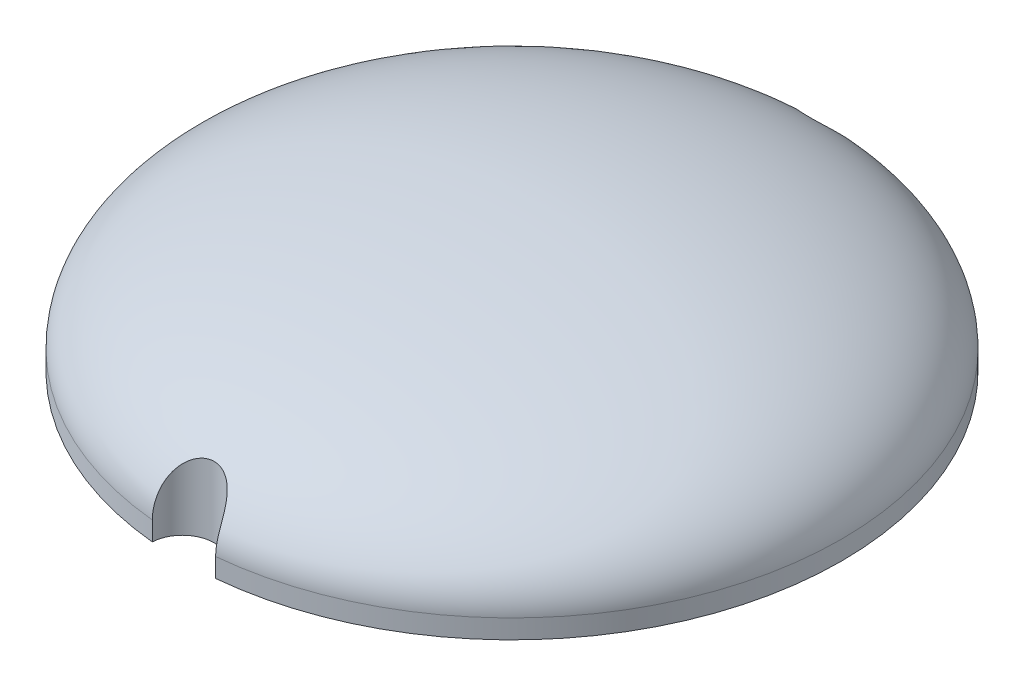
ISO-10303-21;
HEADER;
FILE_DESCRIPTION(('STEP AP214'),'2;1');
FILE_NAME('part.step','',(''),(''),'','','');
FILE_SCHEMA(('AUTOMOTIVE_DESIGN { 1 0 10303 214 1 1 1 1 }'));
ENDSEC;
DATA;
#1=APPLICATION_CONTEXT('core data for automotive mechanical design processes');
#2=APPLICATION_PROTOCOL_DEFINITION('international standard','automotive_design',2000,#1);
#3=PRODUCT_CONTEXT('',#1,'mechanical');
#4=PRODUCT('Part','Part','',(#3));
#5=PRODUCT_RELATED_PRODUCT_CATEGORY('part','',(#4));
#6=PRODUCT_DEFINITION_FORMATION('','',#4);
#7=PRODUCT_DEFINITION_CONTEXT('part definition',#1,'design');
#8=PRODUCT_DEFINITION('design','',#6,#7);
#9=PRODUCT_DEFINITION_SHAPE('','',#8);
#10=(LENGTH_UNIT() NAMED_UNIT(*) SI_UNIT(.MILLI.,.METRE.));
#11=(NAMED_UNIT(*) PLANE_ANGLE_UNIT() SI_UNIT($,.RADIAN.));
#12=(NAMED_UNIT(*) SI_UNIT($,.STERADIAN.) SOLID_ANGLE_UNIT());
#13=UNCERTAINTY_MEASURE_WITH_UNIT(LENGTH_MEASURE(1.E-05),#10,'distance_accuracy_value','');
#14=(GEOMETRIC_REPRESENTATION_CONTEXT(3) GLOBAL_UNCERTAINTY_ASSIGNED_CONTEXT((#13)) GLOBAL_UNIT_ASSIGNED_CONTEXT((#10,
#11,#12)) REPRESENTATION_CONTEXT('',''));
#15=CARTESIAN_POINT('',(0.,0.,0.));
#16=DIRECTION('',(0.,0.,1.));
#17=DIRECTION('',(1.,0.,0.));
#18=AXIS2_PLACEMENT_3D('',#15,#16,#17);
#19=CARTESIAN_POINT('',(0.,1.5,0.));
#20=DIRECTION('',(0.,-1.,0.));
#21=DIRECTION('',(0.,0.,-1.));
#22=AXIS2_PLACEMENT_3D('',#19,#20,#21);
#23=CYLINDRICAL_SURFACE('',#22,26.);
#24=DIRECTION('',(0.,-1.,0.));
#25=VECTOR('',#24,1.);
#26=CARTESIAN_POINT('',(2.49710909036262,5.5,-25.8798076923077));
#27=LINE('',#26,#25);
#28=CARTESIAN_POINT('',(2.49710909036262,1.50000000000001,-25.8798076923077));
#29=VERTEX_POINT('',#28);
#30=CARTESIAN_POINT('',(2.49710909036262,0.,-25.8798076923077));
#31=VERTEX_POINT('',#30);
#32=EDGE_CURVE('E215',#29,#31,#27,.T.);
#33=ORIENTED_EDGE('',*,*,#32,.F.);
#34=CARTESIAN_POINT('',(0.,1.5,0.));
#35=DIRECTION('',(0.,1.,0.));
#36=DIRECTION('',(0.,0.,1.));
#37=AXIS2_PLACEMENT_3D('',#34,#35,#36);
#38=CIRCLE('',#37,26.);
#39=CARTESIAN_POINT('',(2.49710909036262,1.5,25.8798076923077));
#40=VERTEX_POINT('',#39);
#41=EDGE_CURVE('E122',#40,#29,#38,.T.);
#42=ORIENTED_EDGE('',*,*,#41,.F.);
#43=DIRECTION('',(0.,-1.,0.));
#44=VECTOR('',#43,1.);
#45=CARTESIAN_POINT('',(2.49710909036262,5.5,25.8798076923077));
#46=LINE('',#45,#44);
#47=CARTESIAN_POINT('',(2.49710909036262,0.,25.8798076923077));
#48=VERTEX_POINT('',#47);
#49=EDGE_CURVE('E60',#48,#40,#46,.F.);
#50=ORIENTED_EDGE('',*,*,#49,.F.);
#51=CARTESIAN_POINT('',(0.,0.,0.));
#52=DIRECTION('',(0.,1.,0.));
#53=DIRECTION('',(0.,0.,1.));
#54=AXIS2_PLACEMENT_3D('',#51,#52,#53);
#55=CIRCLE('',#54,26.);
#56=EDGE_CURVE('E120',#48,#31,#55,.T.);
#57=ORIENTED_EDGE('',*,*,#56,.T.);
#58=EDGE_LOOP('',(#33,#42,#50,#57));
#59=FACE_BOUND('',#58,.T.);
#60=ADVANCED_FACE('F33',(#59),#23,.T.);
#61=DIRECTION('',(0.,-1.,0.));
#62=VECTOR('',#61,1.);
#63=CARTESIAN_POINT('',(-2.49710909036261,5.5,-25.8798076923077));
#64=LINE('',#63,#62);
#65=CARTESIAN_POINT('',(-2.49710909036261,0.,-25.8798076923077));
#66=VERTEX_POINT('',#65);
#67=CARTESIAN_POINT('',(-2.49710909036261,1.5,-25.8798076923077));
#68=VERTEX_POINT('',#67);
#69=EDGE_CURVE('E52',#66,#68,#64,.F.);
#70=ORIENTED_EDGE('',*,*,#69,.F.);
#71=CARTESIAN_POINT('',(-2.49710909036261,0.,25.8798076923077));
#72=VERTEX_POINT('',#71);
#73=EDGE_CURVE('E128',#66,#72,#55,.T.);
#74=ORIENTED_EDGE('',*,*,#73,.T.);
#75=DIRECTION('',(0.,-1.,0.));
#76=VECTOR('',#75,1.);
#77=CARTESIAN_POINT('',(-2.49710909036261,5.5,25.8798076923077));
#78=LINE('',#77,#76);
#79=CARTESIAN_POINT('',(-2.49710909036261,1.5,25.8798076923077));
#80=VERTEX_POINT('',#79);
#81=EDGE_CURVE('E109',#80,#72,#78,.T.);
#82=ORIENTED_EDGE('',*,*,#81,.F.);
#83=EDGE_CURVE('E127',#68,#80,#38,.T.);
#84=ORIENTED_EDGE('',*,*,#83,.F.);
#85=EDGE_LOOP('',(#70,#74,#82,#84));
#86=FACE_BOUND('',#85,.T.);
#87=ADVANCED_FACE('F222',(#86),#23,.T.);
#88=CARTESIAN_POINT('',(0.,1.5,2.53941832839555E-11));
#89=DIRECTION('',(-1.,0.,0.));
#90=DIRECTION('',(0.,0.,1.));
#91=AXIS2_PLACEMENT_3D('',#88,#89,#90);
#92=ELLIPSE('',#91,25.9999999999746,9.5);
#93=TRIMMED_CURVE('',#92,(PARAMETER_VALUE(-1.57079632679587)),
(PARAMETER_VALUE(1.57079632679587)),.T.,.PARAMETER.);
#94=CARTESIAN_POINT('',(0.,14.2648787199803,0.));
#95=DIRECTION('',(0.,1.,0.));
#96=AXIS1_PLACEMENT('',#94,#95);
#97=SURFACE_OF_REVOLUTION('',#93,#96);
#98=CARTESIAN_POINT('',(0.,11.,2.53894071614388E-11));
#99=VERTEX_POINT('',#98);
#100=VERTEX_LOOP('',#99);
#101=FACE_BOUND('',#100,.T.);
#102=CARTESIAN_POINT('',(-2.4971090903626,1.50000000000001,-25.8798076923077));
#103=CARTESIAN_POINT('',(-2.49710624394118,1.55341695904701,-25.8798097912219));
#104=CARTESIAN_POINT('',(-2.49705005869269,1.60682605746529,-25.8785742050383));
#105=CARTESIAN_POINT('',(-2.49680687563137,1.71352660882144,-25.8736498455342));
#106=CARTESIAN_POINT('',(-2.49661988822556,1.76681807078045,-25.8699612673824));
#107=CARTESIAN_POINT('',(-2.49582716819387,1.92624465997996,-25.855261117715));
#108=CARTESIAN_POINT('',(-2.49498978936412,2.03206426873638,-25.8406150197973));
#109=CARTESIAN_POINT('',(-2.4922372094038,2.2412986118201,-25.8022198375015));
#110=CARTESIAN_POINT('',(-2.49032890980472,2.34472437313747,-25.7785293490173));
#111=CARTESIAN_POINT('',(-2.48473508591958,2.549244613511,-25.7227340091191));
#112=CARTESIAN_POINT('',(-2.48104921357176,2.65033863193094,-25.6906275103509));
#113=CARTESIAN_POINT('',(-2.47121978776096,2.84606182265476,-25.6201456029459));
#114=CARTESIAN_POINT('',(-2.46516980842894,2.9407926143211,-25.5820384959844));
#115=CARTESIAN_POINT('',(-2.44977777276218,3.12722151203189,-25.499653127718));
#116=CARTESIAN_POINT('',(-2.44043584602792,3.21891973730982,-25.4553751093969));
#117=CARTESIAN_POINT('',(-2.40610433895195,3.48934192510849,-25.3144313995545));
#118=CARTESIAN_POINT('',(-2.37481453487873,3.66321939221226,-25.2097213909558));
#119=CARTESIAN_POINT('',(-2.29044688771419,3.98831960619873,-24.9915673466667));
#120=CARTESIAN_POINT('',(-2.2383898215817,4.1402029905835,-24.8787114432373));
#121=CARTESIAN_POINT('',(-2.10711805869213,4.42768197950864,-24.6481202505872));
#122=CARTESIAN_POINT('',(-2.02795001459273,4.56330502715286,-24.530393646847));
#123=CARTESIAN_POINT('',(-1.86175210276437,4.78393307138339,-24.3277017031838));
#124=CARTESIAN_POINT('',(-1.78147665533087,4.87317255760813,-24.2418173089197));
#125=CARTESIAN_POINT('',(-1.60227497817917,5.03859251381934,-24.0771196668494));
#126=CARTESIAN_POINT('',(-1.50336954981815,5.11478736941751,-23.9982986758591));
#127=CARTESIAN_POINT('',(-1.30541422339308,5.24028880751139,-23.8651324635633));
#128=CARTESIAN_POINT('',(-1.20914316565512,5.29196057356589,-23.8088978241283));
#129=CARTESIAN_POINT('',(-1.00523721648505,5.38305677182212,-23.7081879964541));
#130=CARTESIAN_POINT('',(-0.897606387911855,5.42248556300851,-23.6637086237151));
#131=CARTESIAN_POINT('',(-0.672713758007499,5.48780819015115,-23.58928231491));
#132=CARTESIAN_POINT('',(-0.555398293530508,5.51361981329053,-23.5594237269234));
#133=CARTESIAN_POINT('',(-0.315402397392194,5.55015473552205,-23.516989553604));
#134=CARTESIAN_POINT('',(-0.192724805916543,5.56088592483663,-23.5044049304532));
#135=CARTESIAN_POINT('',(0.0403802235505786,5.5664401472196,-23.4978999174672));
#136=CARTESIAN_POINT('',(0.150725068286989,5.5628315437781,-23.5021393815487));
#137=CARTESIAN_POINT('',(0.368791875807462,5.54331854653264,-23.524923644475));
#138=CARTESIAN_POINT('',(0.476514301768498,5.52741634054249,-23.5434658979427));
#139=CARTESIAN_POINT('',(0.684340286308243,5.48435310393289,-23.5931586839655));
#140=CARTESIAN_POINT('',(0.784550313513725,5.45741375476774,-23.6240606951149));
#141=CARTESIAN_POINT('',(0.977412599647034,5.39319743621409,-23.6966779640195));
#142=CARTESIAN_POINT('',(1.07006347985996,5.35591858643191,-23.7383951885938));
#143=CARTESIAN_POINT('',(1.25389422448846,5.26845471813444,-23.8344959234215));
#144=CARTESIAN_POINT('',(1.34426718074681,5.21743729668224,-23.8896586597765));
#145=CARTESIAN_POINT('',(1.51340834310876,5.1057706812144,-24.0074532562347));
#146=CARTESIAN_POINT('',(1.59216904597103,5.04511531177922,-24.0700898987164));
#147=CARTESIAN_POINT('',(1.77054402623766,4.88625451197404,-24.2293608895777));
#148=CARTESIAN_POINT('',(1.86367401808021,4.78340688736514,-24.3286462820304));
#149=CARTESIAN_POINT('',(2.02643267298602,4.56297454059813,-24.5301644309007));
#150=CARTESIAN_POINT('',(2.09601749731148,4.44536288119333,-24.6324023047398));
#151=CARTESIAN_POINT('',(2.19359068739828,4.24119529961586,-24.798370554309));
#152=CARTESIAN_POINT('',(2.22761232643062,4.15818698820469,-24.8630481657182));
#153=CARTESIAN_POINT('',(2.28782763208311,3.98734296935603,-24.9896740271731));
#154=CARTESIAN_POINT('',(2.31401917717838,3.89950596122534,-25.0516215336413));
#155=CARTESIAN_POINT('',(2.3596078962205,3.71929105817941,-25.1715245075076));
#156=CARTESIAN_POINT('',(2.37899567731774,3.62690708494116,-25.2294743680834));
#157=CARTESIAN_POINT('',(2.41201640554448,3.43802562061006,-25.3400700319838));
#158=CARTESIAN_POINT('',(2.42564912240267,3.34152796509083,-25.3927156230102));
#159=CARTESIAN_POINT('',(2.44849347648769,3.14281565927655,-25.4925041455478));
#160=CARTESIAN_POINT('',(2.4576132051858,3.0405260193114,-25.5395189727771));
#161=CARTESIAN_POINT('',(2.47219553878029,2.83245441819386,-25.6256243028815));
#162=CARTESIAN_POINT('',(2.47765975973531,2.72667402199747,-25.6647183021291));
#163=CARTESIAN_POINT('',(2.48603256039021,2.51239807954709,-25.7338180293352));
#164=CARTESIAN_POINT('',(2.48894814536963,2.40391082419284,-25.7638485197007));
#165=CARTESIAN_POINT('',(2.49319949988926,2.18468834433723,-25.8140083334306));
#166=CARTESIAN_POINT('',(2.49453630814372,2.07395464666546,-25.8341441616268));
#167=CARTESIAN_POINT('',(2.49605332275366,1.88589462844477,-25.8592035279054));
#168=CARTESIAN_POINT('',(2.49646433345431,1.80893276263766,-25.8669138122659));
#169=CARTESIAN_POINT('',(2.49698478854025,1.65465216231415,-25.8772232197041));
#170=CARTESIAN_POINT('',(2.49709417370775,1.57733336070519,-25.8798213390875));
#171=CARTESIAN_POINT('',(2.49710909036262,1.50000000000001,-25.8798076923077));
#172=B_SPLINE_CURVE_WITH_KNOTS('',3,(#102,#103,#104,#105,#106,#107,#108,#109,#110,#111,#112,
#113,#114,#115,#116,#117,#118,#119,#120,#121,#122,#123,#124,#125,#126,#127,#128,#129,#130,#131,
#132,#133,#134,#135,#136,#137,#138,#139,#140,#141,#142,#143,#144,#145,#146,#147,#148,#149,#150,
#151,#152,#153,#154,#155,#156,#157,#158,#159,#160,#161,#162,#163,#164,#165,#166,#167,#168,#169,
#170,#171),.UNSPECIFIED.,.F.,.F.,(4,2,2,2,2,2,2,2,2,2,2,2,2,2,2,2,2,2,2,2,2,2,2,2,2,2,2,2,2,2,2,
2,2,2,4),(0.,0.160221187304016,0.320429628365959,0.640451193043306,0.958433683737265,
1.27647846302685,1.58303617717758,1.88958182382499,2.50322566958813,3.08983102808078,
3.67543198477302,4.11660673889516,4.55729178713136,4.92443105553475,5.29143945751464,
5.66063900071193,6.02964530328309,6.35946453437608,6.68922508315804,7.01266395823681,
7.33616169415328,7.68739005815752,8.0388443825329,8.54788517646423,9.05786860400898,
9.38926148652375,9.72074407707921,10.052682507895,10.3846342189543,10.7230934042663,
11.0614028615437,11.3987794776906,11.7359340019718,11.967818008106,12.1997475365273),.UNSPECIFIED.);
#173=EDGE_CURVE('E11',#68,#29,#172,.T.);
#174=ORIENTED_EDGE('',*,*,#173,.F.);
#175=ORIENTED_EDGE('',*,*,#83,.T.);
#176=CARTESIAN_POINT('',(2.49710909036262,1.5,25.8798076923077));
#177=CARTESIAN_POINT('',(2.49710624394119,1.553416959047,25.8798097912219));
#178=CARTESIAN_POINT('',(2.49705005869271,1.60682605746528,25.8785742050383));
#179=CARTESIAN_POINT('',(2.49680687563138,1.71352660882143,25.8736498455342));
#180=CARTESIAN_POINT('',(2.49661988822557,1.76681807078044,25.8699612673824));
#181=CARTESIAN_POINT('',(2.49582716819389,1.92624465997995,25.855261117715));
#182=CARTESIAN_POINT('',(2.49498978936413,2.03206426873637,25.8406150197973));
#183=CARTESIAN_POINT('',(2.49223720940381,2.24129861182009,25.8022198375015));
#184=CARTESIAN_POINT('',(2.49032890980473,2.34472437313746,25.7785293490173));
#185=CARTESIAN_POINT('',(2.4847350859196,2.54924461351099,25.7227340091191));
#186=CARTESIAN_POINT('',(2.48104921357178,2.65033863193093,25.6906275103509));
#187=CARTESIAN_POINT('',(2.47121978776098,2.84606182265476,25.6201456029459));
#188=CARTESIAN_POINT('',(2.46516980842895,2.94079261432109,25.5820384959844));
#189=CARTESIAN_POINT('',(2.4497777727622,3.12722151203188,25.499653127718));
#190=CARTESIAN_POINT('',(2.44043584602794,3.21891973730981,25.4553751093969));
#191=CARTESIAN_POINT('',(2.40610433895197,3.48934192510848,25.3144313995545));
#192=CARTESIAN_POINT('',(2.37481453487875,3.66321939221225,25.2097213909558));
#193=CARTESIAN_POINT('',(2.29044688771421,3.98831960619872,24.9915673466667));
#194=CARTESIAN_POINT('',(2.23838982158172,4.14020299058349,24.8787114432373));
#195=CARTESIAN_POINT('',(2.10711805869215,4.42768197950863,24.6481202505872));
#196=CARTESIAN_POINT('',(2.02795001459275,4.56330502715285,24.530393646847));
#197=CARTESIAN_POINT('',(1.86175210276439,4.78393307138338,24.3277017031839));
#198=CARTESIAN_POINT('',(1.78147665533089,4.87317255760811,24.2418173089197));
#199=CARTESIAN_POINT('',(1.60227497817919,5.03859251381933,24.0771196668494));
#200=CARTESIAN_POINT('',(1.50336954981817,5.1147873694175,23.9982986758591));
#201=CARTESIAN_POINT('',(1.3054142233931,5.24028880751139,23.8651324635634));
#202=CARTESIAN_POINT('',(1.20914316565514,5.29196057356588,23.8088978241284));
#203=CARTESIAN_POINT('',(1.00523721648508,5.38305677182212,23.7081879964541));
#204=CARTESIAN_POINT('',(0.897606387911882,5.4224855630085,23.6637086237151));
#205=CARTESIAN_POINT('',(0.672713758007526,5.48780819015115,23.58928231491));
#206=CARTESIAN_POINT('',(0.555398293530534,5.51361981329053,23.5594237269234));
#207=CARTESIAN_POINT('',(0.315402397392219,5.55015473552204,23.516989553604));
#208=CARTESIAN_POINT('',(0.192724805916567,5.56088592483662,23.5044049304532));
#209=CARTESIAN_POINT('',(-0.0403802235505533,5.56644014721959,23.4978999174672));
#210=CARTESIAN_POINT('',(-0.150725068286963,5.56283154377809,23.5021393815487));
#211=CARTESIAN_POINT('',(-0.368791875807434,5.54331854653263,23.524923644475));
#212=CARTESIAN_POINT('',(-0.476514301768471,5.52741634054249,23.5434658979427));
#213=CARTESIAN_POINT('',(-0.684340286308216,5.48435310393289,23.5931586839655));
#214=CARTESIAN_POINT('',(-0.784550313513698,5.45741375476773,23.6240606951149));
#215=CARTESIAN_POINT('',(-0.977412599647016,5.39319743621409,23.6966779640195));
#216=CARTESIAN_POINT('',(-1.07006347985995,5.35591858643192,23.7383951885938));
#217=CARTESIAN_POINT('',(-1.25389422448845,5.26845471813445,23.8344959234215));
#218=CARTESIAN_POINT('',(-1.34426718074679,5.21743729668225,23.8896586597765));
#219=CARTESIAN_POINT('',(-1.51340834310874,5.1057706812144,24.0074532562347));
#220=CARTESIAN_POINT('',(-1.59216904597102,5.04511531177922,24.0700898987164));
#221=CARTESIAN_POINT('',(-1.77054402623765,4.88625451197405,24.2293608895776));
#222=CARTESIAN_POINT('',(-1.8636740180802,4.78340688736514,24.3286462820304));
#223=CARTESIAN_POINT('',(-2.026432672986,4.56297454059813,24.5301644309006));
#224=CARTESIAN_POINT('',(-2.09601749731147,4.44536288119333,24.6324023047398));
#225=CARTESIAN_POINT('',(-2.19359068739827,4.24119529961587,24.7983705543089));
#226=CARTESIAN_POINT('',(-2.2276123264306,4.1581869882047,24.8630481657182));
#227=CARTESIAN_POINT('',(-2.28782763208309,3.98734296935604,24.9896740271731));
#228=CARTESIAN_POINT('',(-2.31401917717836,3.89950596122535,25.0516215336413));
#229=CARTESIAN_POINT('',(-2.35960789622048,3.71929105817942,25.1715245075076));
#230=CARTESIAN_POINT('',(-2.37899567731772,3.62690708494117,25.2294743680834));
#231=CARTESIAN_POINT('',(-2.41201640554447,3.43802562061007,25.3400700319838));
#232=CARTESIAN_POINT('',(-2.42564912240266,3.34152796509085,25.3927156230102));
#233=CARTESIAN_POINT('',(-2.44849347648768,3.14281565927656,25.4925041455478));
#234=CARTESIAN_POINT('',(-2.45761320518579,3.04052601931142,25.5395189727771));
#235=CARTESIAN_POINT('',(-2.47219553878027,2.83245441819388,25.6256243028815));
#236=CARTESIAN_POINT('',(-2.4776597597353,2.72667402199748,25.6647183021291));
#237=CARTESIAN_POINT('',(-2.4860325603902,2.5123980795471,25.7338180293352));
#238=CARTESIAN_POINT('',(-2.48894814536961,2.40391082419286,25.7638485197007));
#239=CARTESIAN_POINT('',(-2.49319949988925,2.18468834433724,25.8140083334306));
#240=CARTESIAN_POINT('',(-2.49453630814372,2.07395464666548,25.8341441616268));
#241=CARTESIAN_POINT('',(-2.49605332275366,1.88589462844479,25.8592035279054));
#242=CARTESIAN_POINT('',(-2.4964643334543,1.80893276263767,25.8669138122659));
#243=CARTESIAN_POINT('',(-2.49698478854024,1.65465216231416,25.8772232197041));
#244=CARTESIAN_POINT('',(-2.49709417370773,1.57733336070519,25.8798213390875));
#245=CARTESIAN_POINT('',(-2.4971090903626,1.5,25.8798076923077));
#246=B_SPLINE_CURVE_WITH_KNOTS('',3,(#176,#177,#178,#179,#180,#181,#182,#183,#184,#185,#186,
#187,#188,#189,#190,#191,#192,#193,#194,#195,#196,#197,#198,#199,#200,#201,#202,#203,#204,#205,
#206,#207,#208,#209,#210,#211,#212,#213,#214,#215,#216,#217,#218,#219,#220,#221,#222,#223,#224,
#225,#226,#227,#228,#229,#230,#231,#232,#233,#234,#235,#236,#237,#238,#239,#240,#241,#242,#243,
#244,#245),.UNSPECIFIED.,.F.,.F.,(4,2,2,2,2,2,2,2,2,2,2,2,2,2,2,2,2,2,2,2,2,2,2,2,2,2,2,2,2,2,2,
2,2,2,4),(0.,0.160221187304015,0.320429628365957,0.640451193043304,0.958433683737264,
1.27647846302684,1.58303617717757,1.88958182382498,2.50322566958812,3.08983102808077,
3.67543198477301,4.11660673889515,4.55729178713135,4.92443105553474,5.29143945751463,
5.66063900071192,6.02964530328308,6.35946453437607,6.68922508315803,7.0126639582368,
7.33616169415328,7.68739005815752,8.03884438253289,8.54788517646423,9.05786860400898,
9.38926148652374,9.7207440770792,10.052682507895,10.3846342189543,10.7230934042663,
11.0614028615437,11.3987794776906,11.7359340019718,11.967818008106,12.1997475365274),.UNSPECIFIED.);
#247=EDGE_CURVE('E46',#40,#80,#246,.T.);
#248=ORIENTED_EDGE('',*,*,#247,.F.);
#249=ORIENTED_EDGE('',*,*,#41,.T.);
#250=EDGE_LOOP('',(#174,#175,#248,#249));
#251=FACE_BOUND('',#250,.T.);
#252=ADVANCED_FACE('F139',(#101,#251),#97,.T.);
#253=CARTESIAN_POINT('',(0.,1.5,0.));
#254=DIRECTION('',(0.,-1.,0.));
#255=DIRECTION('',(0.,0.,-1.));
#256=AXIS2_PLACEMENT_3D('',#253,#254,#255);
#257=CYLINDRICAL_SURFACE('',#256,24.);
#258=CARTESIAN_POINT('',(0.,1.5,0.));
#259=DIRECTION('',(0.,1.,0.));
#260=DIRECTION('',(0.,0.,1.));
#261=AXIS2_PLACEMENT_3D('',#258,#259,#260);
#262=CIRCLE('',#261,24.);
#263=CARTESIAN_POINT('',(-3.3201910546011,1.50000000000001,-23.7692307692308));
#264=VERTEX_POINT('',#263);
#265=CARTESIAN_POINT('',(-3.3201910546011,1.5,23.7692307692308));
#266=VERTEX_POINT('',#265);
#267=EDGE_CURVE('E184',#264,#266,#262,.T.);
#268=ORIENTED_EDGE('',*,*,#267,.T.);
#269=DIRECTION('',(0.,-1.,0.));
#270=VECTOR('',#269,1.);
#271=CARTESIAN_POINT('',(-3.32019105460111,0.750000000000001,23.7692307692308));
#272=LINE('',#271,#270);
#273=CARTESIAN_POINT('',(-3.32019105460113,0.,23.7692307692308));
#274=VERTEX_POINT('',#273);
#275=EDGE_CURVE('E206',#266,#274,#272,.T.);
#276=ORIENTED_EDGE('',*,*,#275,.T.);
#277=CARTESIAN_POINT('',(0.,0.,0.));
#278=DIRECTION('',(0.,1.,0.));
#279=DIRECTION('',(0.,0.,1.));
#280=AXIS2_PLACEMENT_3D('',#277,#278,#279);
#281=CIRCLE('',#280,24.);
#282=CARTESIAN_POINT('',(-3.32019105460112,0.,-23.7692307692308));
#283=VERTEX_POINT('',#282);
#284=EDGE_CURVE('E132',#283,#274,#281,.T.);
#285=ORIENTED_EDGE('',*,*,#284,.F.);
#286=DIRECTION('',(0.,-1.,0.));
#287=VECTOR('',#286,1.);
#288=CARTESIAN_POINT('',(-3.32019105460111,0.750000000000001,-23.7692307692308));
#289=LINE('',#288,#287);
#290=EDGE_CURVE('E202',#283,#264,#289,.F.);
#291=ORIENTED_EDGE('',*,*,#290,.T.);
#292=EDGE_LOOP('',(#268,#276,#285,#291));
#293=FACE_BOUND('',#292,.T.);
#294=ADVANCED_FACE('F175',(#293),#257,.F.);
#295=CARTESIAN_POINT('',(3.32019105460114,0.,23.7692307692308));
#296=VERTEX_POINT('',#295);
#297=CARTESIAN_POINT('',(3.32019105460112,0.,-23.7692307692308));
#298=VERTEX_POINT('',#297);
#299=EDGE_CURVE('E186',#296,#298,#281,.T.);
#300=ORIENTED_EDGE('',*,*,#299,.F.);
#301=DIRECTION('',(0.,-1.,0.));
#302=VECTOR('',#301,1.);
#303=CARTESIAN_POINT('',(3.32019105460112,0.750000000000001,23.7692307692308));
#304=LINE('',#303,#302);
#305=CARTESIAN_POINT('',(3.32019105460111,1.5,23.7692307692308));
#306=VERTEX_POINT('',#305);
#307=EDGE_CURVE('E164',#296,#306,#304,.F.);
#308=ORIENTED_EDGE('',*,*,#307,.T.);
#309=CARTESIAN_POINT('',(3.32019105460111,1.50000000000001,-23.7692307692308));
#310=VERTEX_POINT('',#309);
#311=EDGE_CURVE('E187',#306,#310,#262,.T.);
#312=ORIENTED_EDGE('',*,*,#311,.T.);
#313=DIRECTION('',(0.,-1.,0.));
#314=VECTOR('',#313,1.);
#315=CARTESIAN_POINT('',(3.32019105460112,0.750000000000001,-23.7692307692308));
#316=LINE('',#315,#314);
#317=EDGE_CURVE('E180',#310,#298,#316,.T.);
#318=ORIENTED_EDGE('',*,*,#317,.T.);
#319=EDGE_LOOP('',(#300,#308,#312,#318));
#320=FACE_BOUND('',#319,.T.);
#321=ADVANCED_FACE('F173',(#320),#257,.F.);
#322=CARTESIAN_POINT('',(0.,1.5,2.53941832839555E-11));
#323=DIRECTION('',(1.,0.,0.));
#324=DIRECTION('',(0.,0.,1.));
#325=AXIS2_PLACEMENT_3D('',#322,#323,#324);
#326=ELLIPSE('',#325,23.9999999999746,8.);
#327=TRIMMED_CURVE('',#326,(PARAMETER_VALUE(4.71238898038363)),
(PARAMETER_VALUE(7.85398163397554)),.T.,.PARAMETER.);
#328=CARTESIAN_POINT('',(0.,14.2648787199803,0.));
#329=DIRECTION('',(0.,1.,0.));
#330=AXIS1_PLACEMENT('',#328,#329);
#331=SURFACE_OF_REVOLUTION('',#327,#330);
#332=CARTESIAN_POINT('',(0.,9.5,2.53941832839555E-11));
#333=VERTEX_POINT('',#332);
#334=VERTEX_LOOP('',#333);
#335=FACE_BOUND('',#334,.T.);
#336=CARTESIAN_POINT('',(-3.3201910546011,1.5,23.7692307692308));
#337=CARTESIAN_POINT('',(-3.32019124133158,1.57353196378655,23.7692621977172));
#338=CARTESIAN_POINT('',(-3.31830499640199,1.64704968175994,23.7664242440313));
#339=CARTESIAN_POINT('',(-3.31076582619783,1.79341634919177,23.7552479461323));
#340=CARTESIAN_POINT('',(-3.30511580287918,1.86626577008607,23.7469138396233));
#341=CARTESIAN_POINT('',(-3.2901111188169,2.01023453492397,23.725064294164));
#342=CARTESIAN_POINT('',(-3.28078425620688,2.08136270498108,23.7115877576614));
#343=CARTESIAN_POINT('',(-3.25843677623042,2.22194786726573,23.6798779537594));
#344=CARTESIAN_POINT('',(-3.24541562077164,2.29140461444216,23.6616439934485));
#345=CARTESIAN_POINT('',(-3.20089348903176,2.49624475992308,23.6006628562279));
#346=CARTESIAN_POINT('',(-3.16388074425521,2.62861341009665,23.551552359415));
#347=CARTESIAN_POINT('',(-3.07516279689628,2.88297129547335,23.4410195965549));
#348=CARTESIAN_POINT('',(-3.02342984069666,3.0049403532026,23.3795741391297));
#349=CARTESIAN_POINT('',(-2.89822829868123,3.25119737731787,23.2413859147839));
#350=CARTESIAN_POINT('',(-2.82289534062614,3.37400421450644,23.1636922239703));
#351=CARTESIAN_POINT('',(-2.65416791436467,3.60419825535935,23.0052034115175));
#352=CARTESIAN_POINT('',(-2.56076803099843,3.7115808190825,22.9244073658502));
#353=CARTESIAN_POINT('',(-2.34153525560729,3.92511640883316,22.753585746216));
#354=CARTESIAN_POINT('',(-2.2129545766553,4.02877865826125,22.6639447534539));
#355=CARTESIAN_POINT('',(-1.93486496157944,4.21458716859136,22.4953247972131));
#356=CARTESIAN_POINT('',(-1.78535274269077,4.29673004872398,22.4163475099838));
#357=CARTESIAN_POINT('',(-1.4690526472747,4.43860004161665,22.2755169025509));
#358=CARTESIAN_POINT('',(-1.30230415263419,4.49837687271634,22.213625682411));
#359=CARTESIAN_POINT('',(-0.955965710423368,4.59500168555911,22.1117266216651));
#360=CARTESIAN_POINT('',(-0.776381285543917,4.63185946285757,22.0717094330297));
#361=CARTESIAN_POINT('',(-0.423027902000763,4.68036129945895,22.0187027133515));
#362=CARTESIAN_POINT('',(-0.249727610887273,4.69358533320449,22.0040220130075));
#363=CARTESIAN_POINT('',(0.0976365738248865,4.69955013925261,21.9974238471074));
#364=CARTESIAN_POINT('',(0.27170025897069,4.6922961931447,22.005500512072));
#365=CARTESIAN_POINT('',(0.608838875189639,4.65807687280542,22.0431039831269));
#366=CARTESIAN_POINT('',(0.772081640626017,4.6318555326471,22.071820871569));
#367=CARTESIAN_POINT('',(1.08994037617179,4.56088127796395,22.1478916010155));
#368=CARTESIAN_POINT('',(1.24455595693109,4.51612752782656,22.1952462823793));
#369=CARTESIAN_POINT('',(1.54477884337277,4.40736036914648,22.3067790365407));
#370=CARTESIAN_POINT('',(1.69010335460325,4.34293429652364,22.3713133476646));
#371=CARTESIAN_POINT('',(1.96476029107606,4.19578795767316,22.5123693648057));
#372=CARTESIAN_POINT('',(2.09408989243245,4.11306446822236,22.588893182168));
#373=CARTESIAN_POINT('',(2.34250797039835,3.92387084200832,22.7540287664481));
#374=CARTESIAN_POINT('',(2.46037319334569,3.81620134348125,22.843103805191));
#375=CARTESIAN_POINT('',(2.67419560570319,3.58105617288314,23.0220609700224));
#376=CARTESIAN_POINT('',(2.77012607861242,3.45355666196868,23.1119439432101));
#377=CARTESIAN_POINT('',(2.89880205894999,3.24513080810318,23.2430150225451));
#378=CARTESIAN_POINT('',(2.9398729136563,3.17096421175558,23.2869967152215));
#379=CARTESIAN_POINT('',(3.01573658895705,3.01768183216897,23.3715881665674));
#380=CARTESIAN_POINT('',(3.05053271396068,2.93856868362949,23.4121996939205));
#381=CARTESIAN_POINT('',(3.11374515081416,2.77590171578722,23.4886162149401));
#382=CARTESIAN_POINT('',(3.1421786344732,2.69236062035718,23.5244340383257));
#383=CARTESIAN_POINT('',(3.1927582425874,2.52115705155542,23.5900184215141));
#384=CARTESIAN_POINT('',(3.21490976034082,2.43349818927746,23.6197901658244));
#385=CARTESIAN_POINT('',(3.24823358598269,2.27683188094001,23.6655686087633));
#386=CARTESIAN_POINT('',(3.26076632415843,2.208571385147,23.6831587034601));
#387=CARTESIAN_POINT('',(3.28227079401891,2.0704878406531,23.7137265607279));
#388=CARTESIAN_POINT('',(3.29124370920005,2.00066531943117,23.7267058560519));
#389=CARTESIAN_POINT('',(3.30568167957829,1.85936620685776,23.7477471515763));
#390=CARTESIAN_POINT('',(3.31111925636532,1.7878810291439,23.7557706090477));
#391=CARTESIAN_POINT('',(3.31837579814185,1.64426827810866,23.766529617575));
#392=CARTESIAN_POINT('',(3.32019149172072,1.57214018308278,23.7692603880292));
#393=CARTESIAN_POINT('',(3.32019105460112,1.5,23.7692307692308));
#394=B_SPLINE_CURVE_WITH_KNOTS('',3,(#336,#337,#338,#339,#340,#341,#342,#343,#344,#345,#346,
#347,#348,#349,#350,#351,#352,#353,#354,#355,#356,#357,#358,#359,#360,#361,#362,#363,#364,#365,
#366,#367,#368,#369,#370,#371,#372,#373,#374,#375,#376,#377,#378,#379,#380,#381,#382,#383,#384,
#385,#386,#387,#388,#389,#390,#391,#392,#393),.UNSPECIFIED.,.F.,.F.,(4,2,2,2,2,2,2,2,2,2,2,2,2,
2,2,2,2,2,2,2,2,2,2,2,2,2,2,2,4),(0.,0.220493783604816,0.440817758119277,0.659507007023393,
0.878228125484048,1.3141154902394,1.75083018919781,2.23999994387271,2.72931654414587,
3.29040744499896,3.85158644243662,4.4115104559719,4.97119499437964,5.49182388471605,
6.01231850903337,6.51343195449319,7.01456799724579,7.52703710610924,8.03959656213486,
8.58568345913065,9.13243198773629,9.4186343385765,9.70468552605032,9.98995513517573,
10.2749790832539,10.4895342990669,10.7040181240982,10.9201497027037,11.1364764106181),.UNSPECIFIED.);
#395=EDGE_CURVE('E156',#266,#306,#394,.T.);
#396=ORIENTED_EDGE('',*,*,#395,.F.);
#397=ORIENTED_EDGE('',*,*,#267,.F.);
#398=CARTESIAN_POINT('',(3.32019105460112,1.50000000000001,-23.7692307692308));
#399=CARTESIAN_POINT('',(3.32019124133159,1.57353196378655,-23.7692621977172));
#400=CARTESIAN_POINT('',(3.31830499640199,1.64704968175994,-23.7664242440313));
#401=CARTESIAN_POINT('',(3.31076582619784,1.79341634919178,-23.7552479461323));
#402=CARTESIAN_POINT('',(3.30511580287919,1.86626577008608,-23.7469138396233));
#403=CARTESIAN_POINT('',(3.29011111881691,2.01023453492397,-23.725064294164));
#404=CARTESIAN_POINT('',(3.28078425620688,2.08136270498109,-23.7115877576614));
#405=CARTESIAN_POINT('',(3.25843677623043,2.22194786726573,-23.6798779537594));
#406=CARTESIAN_POINT('',(3.24541562077167,2.29140461444216,-23.6616439934485));
#407=CARTESIAN_POINT('',(3.20089348903179,2.49624475992309,-23.6006628562279));
#408=CARTESIAN_POINT('',(3.16388074425523,2.62861341009666,-23.551552359415));
#409=CARTESIAN_POINT('',(3.07516279689628,2.88297129547335,-23.4410195965549));
#410=CARTESIAN_POINT('',(3.02342984069666,3.00494035320259,-23.3795741391296));
#411=CARTESIAN_POINT('',(2.89822829868124,3.25119737731787,-23.2413859147839));
#412=CARTESIAN_POINT('',(2.82289534062615,3.37400421450645,-23.1636922239703));
#413=CARTESIAN_POINT('',(2.65416791436469,3.60419825535936,-23.0052034115175));
#414=CARTESIAN_POINT('',(2.56076803099843,3.7115808190825,-22.9244073658502));
#415=CARTESIAN_POINT('',(2.34153525560729,3.92511640883317,-22.753585746216));
#416=CARTESIAN_POINT('',(2.21295457665531,4.02877865826126,-22.6639447534538));
#417=CARTESIAN_POINT('',(1.93486496157945,4.21458716859137,-22.4953247972131));
#418=CARTESIAN_POINT('',(1.78535274269078,4.29673004872398,-22.4163475099838));
#419=CARTESIAN_POINT('',(1.46905264727471,4.43860004161665,-22.2755169025509));
#420=CARTESIAN_POINT('',(1.30230415263419,4.49837687271635,-22.213625682411));
#421=CARTESIAN_POINT('',(0.955965710423363,4.59500168555911,-22.1117266216651));
#422=CARTESIAN_POINT('',(0.776381285543908,4.63185946285757,-22.0717094330297));
#423=CARTESIAN_POINT('',(0.423027902000752,4.68036129945895,-22.0187027133515));
#424=CARTESIAN_POINT('',(0.249727610887264,4.69358533320449,-22.0040220130075));
#425=CARTESIAN_POINT('',(-0.0976365738248894,4.69955013925262,-21.9974238471074));
#426=CARTESIAN_POINT('',(-0.27170025897069,4.6922961931447,-22.005500512072));
#427=CARTESIAN_POINT('',(-0.608838875189637,4.65807687280543,-22.0431039831269));
#428=CARTESIAN_POINT('',(-0.772081640626016,4.6318555326471,-22.071820871569));
#429=CARTESIAN_POINT('',(-1.08994037617178,4.56088127796395,-22.1478916010155));
#430=CARTESIAN_POINT('',(-1.24455595693109,4.51612752782656,-22.1952462823793));
#431=CARTESIAN_POINT('',(-1.54477884337277,4.40736036914648,-22.3067790365407));
#432=CARTESIAN_POINT('',(-1.69010335460324,4.34293429652364,-22.3713133476646));
#433=CARTESIAN_POINT('',(-1.96476029107606,4.19578795767316,-22.5123693648057));
#434=CARTESIAN_POINT('',(-2.09408989243245,4.11306446822236,-22.588893182168));
#435=CARTESIAN_POINT('',(-2.34250797039835,3.92387084200832,-22.7540287664481));
#436=CARTESIAN_POINT('',(-2.46037319334569,3.81620134348126,-22.8431038051911));
#437=CARTESIAN_POINT('',(-2.67419560570319,3.58105617288314,-23.0220609700224));
#438=CARTESIAN_POINT('',(-2.77012607861241,3.45355666196868,-23.1119439432101));
#439=CARTESIAN_POINT('',(-2.89880205894998,3.24513080810318,-23.2430150225451));
#440=CARTESIAN_POINT('',(-2.93987291365629,3.17096421175558,-23.2869967152215));
#441=CARTESIAN_POINT('',(-3.01573658895704,3.01768183216897,-23.3715881665674));
#442=CARTESIAN_POINT('',(-3.05053271396067,2.93856868362949,-23.4121996939206));
#443=CARTESIAN_POINT('',(-3.11374515081416,2.77590171578721,-23.4886162149401));
#444=CARTESIAN_POINT('',(-3.1421786344732,2.69236062035718,-23.5244340383257));
#445=CARTESIAN_POINT('',(-3.1927582425874,2.52115705155542,-23.5900184215141));
#446=CARTESIAN_POINT('',(-3.21490976034082,2.43349818927745,-23.6197901658244));
#447=CARTESIAN_POINT('',(-3.24823358598268,2.27683188094,-23.6655686087633));
#448=CARTESIAN_POINT('',(-3.26076632415842,2.20857138514699,-23.6831587034601));
#449=CARTESIAN_POINT('',(-3.2822707940189,2.07048784065309,-23.7137265607279));
#450=CARTESIAN_POINT('',(-3.29124370920004,2.00066531943117,-23.7267058560519));
#451=CARTESIAN_POINT('',(-3.30568167957828,1.85936620685776,-23.7477471515764));
#452=CARTESIAN_POINT('',(-3.3111192563653,1.7878810291439,-23.7557706090477));
#453=CARTESIAN_POINT('',(-3.31837579814184,1.64426827810866,-23.766529617575));
#454=CARTESIAN_POINT('',(-3.3201914917207,1.57214018308279,-23.7692603880292));
#455=CARTESIAN_POINT('',(-3.3201910546011,1.50000000000001,-23.7692307692308));
#456=B_SPLINE_CURVE_WITH_KNOTS('',3,(#398,#399,#400,#401,#402,#403,#404,#405,#406,#407,#408,
#409,#410,#411,#412,#413,#414,#415,#416,#417,#418,#419,#420,#421,#422,#423,#424,#425,#426,#427,
#428,#429,#430,#431,#432,#433,#434,#435,#436,#437,#438,#439,#440,#441,#442,#443,#444,#445,#446,
#447,#448,#449,#450,#451,#452,#453,#454,#455),.UNSPECIFIED.,.F.,.F.,(4,2,2,2,2,2,2,2,2,2,2,2,2,
2,2,2,2,2,2,2,2,2,2,2,2,2,2,2,4),(0.,0.220493783604816,0.440817758119278,0.659507007023393,
0.878228125484045,1.3141154902394,1.75083018919781,2.23999994387271,2.72931654414587,
3.29040744499896,3.85158644243662,4.41151045597191,4.97119499437965,5.49182388471607,
6.01231850903338,6.51343195449319,7.01456799724579,7.52703710610925,8.03959656213487,
8.58568345913066,9.13243198773629,9.4186343385765,9.70468552605033,9.98995513517574,
10.2749790832539,10.4895342990669,10.7040181240982,10.9201497027037,11.1364764106181),.UNSPECIFIED.);
#457=EDGE_CURVE('E205',#310,#264,#456,.T.);
#458=ORIENTED_EDGE('',*,*,#457,.F.);
#459=ORIENTED_EDGE('',*,*,#311,.F.);
#460=EDGE_LOOP('',(#396,#397,#458,#459));
#461=FACE_BOUND('',#460,.T.);
#462=ADVANCED_FACE('F168',(#335,#461),#331,.T.);
#463=CARTESIAN_POINT('',(0.,0.,0.));
#464=DIRECTION('',(0.,1.,0.));
#465=DIRECTION('',(0.,0.,1.));
#466=AXIS2_PLACEMENT_3D('',#463,#464,#465);
#467=PLANE('',#466);
#468=CARTESIAN_POINT('',(0.,0.,-26.));
#469=DIRECTION('',(0.,1.,0.));
#470=DIRECTION('',(0.,0.,1.));
#471=AXIS2_PLACEMENT_3D('',#468,#469,#470);
#472=CIRCLE('',#471,2.5);
#473=EDGE_CURVE('E114',#66,#31,#472,.T.);
#474=ORIENTED_EDGE('',*,*,#473,.T.);
#475=ORIENTED_EDGE('',*,*,#56,.F.);
#476=CARTESIAN_POINT('',(0.,0.,26.));
#477=DIRECTION('',(0.,1.,0.));
#478=DIRECTION('',(0.,0.,1.));
#479=AXIS2_PLACEMENT_3D('',#476,#477,#478);
#480=CIRCLE('',#479,2.5);
#481=EDGE_CURVE('E106',#48,#72,#480,.T.);
#482=ORIENTED_EDGE('',*,*,#481,.T.);
#483=ORIENTED_EDGE('',*,*,#73,.F.);
#484=EDGE_LOOP('',(#474,#475,#482,#483));
#485=FACE_BOUND('',#484,.T.);
#486=ORIENTED_EDGE('',*,*,#284,.T.);
#487=CARTESIAN_POINT('',(0.,0.,26.));
#488=DIRECTION('',(0.,1.,0.));
#489=DIRECTION('',(0.,0.,1.));
#490=AXIS2_PLACEMENT_3D('',#487,#488,#489);
#491=CIRCLE('',#490,4.);
#492=EDGE_CURVE('E165',#296,#274,#491,.T.);
#493=ORIENTED_EDGE('',*,*,#492,.F.);
#494=ORIENTED_EDGE('',*,*,#299,.T.);
#495=CARTESIAN_POINT('',(0.,0.,-26.));
#496=DIRECTION('',(0.,1.,0.));
#497=DIRECTION('',(0.,0.,1.));
#498=AXIS2_PLACEMENT_3D('',#495,#496,#497);
#499=CIRCLE('',#498,4.);
#500=EDGE_CURVE('E194',#283,#298,#499,.T.);
#501=ORIENTED_EDGE('',*,*,#500,.F.);
#502=EDGE_LOOP('',(#486,#493,#494,#501));
#503=FACE_BOUND('',#502,.T.);
#504=ADVANCED_FACE('F125',(#485,#503),#467,.F.);
#505=CARTESIAN_POINT('',(0.,26.3040933210743,-26.));
#506=DIRECTION('',(0.,-1.,0.));
#507=DIRECTION('',(0.,0.,-1.));
#508=AXIS2_PLACEMENT_3D('',#505,#506,#507);
#509=CYLINDRICAL_SURFACE('',#508,4.);
#510=ORIENTED_EDGE('',*,*,#317,.F.);
#511=ORIENTED_EDGE('',*,*,#457,.T.);
#512=ORIENTED_EDGE('',*,*,#290,.F.);
#513=ORIENTED_EDGE('',*,*,#500,.T.);
#514=EDGE_LOOP('',(#510,#511,#512,#513));
#515=FACE_BOUND('',#514,.T.);
#516=ADVANCED_FACE('F152',(#515),#509,.T.);
#517=CARTESIAN_POINT('',(0.,26.3040933210743,26.));
#518=DIRECTION('',(0.,-1.,0.));
#519=DIRECTION('',(0.,0.,-1.));
#520=AXIS2_PLACEMENT_3D('',#517,#518,#519);
#521=CYLINDRICAL_SURFACE('',#520,4.);
#522=ORIENTED_EDGE('',*,*,#275,.F.);
#523=ORIENTED_EDGE('',*,*,#395,.T.);
#524=ORIENTED_EDGE('',*,*,#307,.F.);
#525=ORIENTED_EDGE('',*,*,#492,.T.);
#526=EDGE_LOOP('',(#522,#523,#524,#525));
#527=FACE_BOUND('',#526,.T.);
#528=ADVANCED_FACE('F148',(#527),#521,.T.);
#529=CARTESIAN_POINT('',(0.,11.,26.));
#530=DIRECTION('',(0.,-1.,0.));
#531=DIRECTION('',(0.,0.,-1.));
#532=AXIS2_PLACEMENT_3D('',#529,#530,#531);
#533=CYLINDRICAL_SURFACE('',#532,2.5);
#534=ORIENTED_EDGE('',*,*,#81,.T.);
#535=ORIENTED_EDGE('',*,*,#481,.F.);
#536=ORIENTED_EDGE('',*,*,#49,.T.);
#537=ORIENTED_EDGE('',*,*,#247,.T.);
#538=EDGE_LOOP('',(#534,#535,#536,#537));
#539=FACE_BOUND('',#538,.T.);
#540=ADVANCED_FACE('F107',(#539),#533,.F.);
#541=CARTESIAN_POINT('',(0.,11.,-26.));
#542=DIRECTION('',(0.,-1.,0.));
#543=DIRECTION('',(0.,0.,-1.));
#544=AXIS2_PLACEMENT_3D('',#541,#542,#543);
#545=CYLINDRICAL_SURFACE('',#544,2.5);
#546=ORIENTED_EDGE('',*,*,#32,.T.);
#547=ORIENTED_EDGE('',*,*,#473,.F.);
#548=ORIENTED_EDGE('',*,*,#69,.T.);
#549=ORIENTED_EDGE('',*,*,#173,.T.);
#550=EDGE_LOOP('',(#546,#547,#548,#549));
#551=FACE_BOUND('',#550,.T.);
#552=ADVANCED_FACE('F147',(#551),#545,.F.);
#553=CLOSED_SHELL('',(#60,#87,#252,#294,#321,#462,#504,#516,#528,#540,#552));
#554=MANIFOLD_SOLID_BREP('B2',#553);
#555=ADVANCED_BREP_SHAPE_REPRESENTATION('',(#18,#554),#14);
#556=SHAPE_DEFINITION_REPRESENTATION(#9,#555);
ENDSEC;
END-ISO-10303-21;
